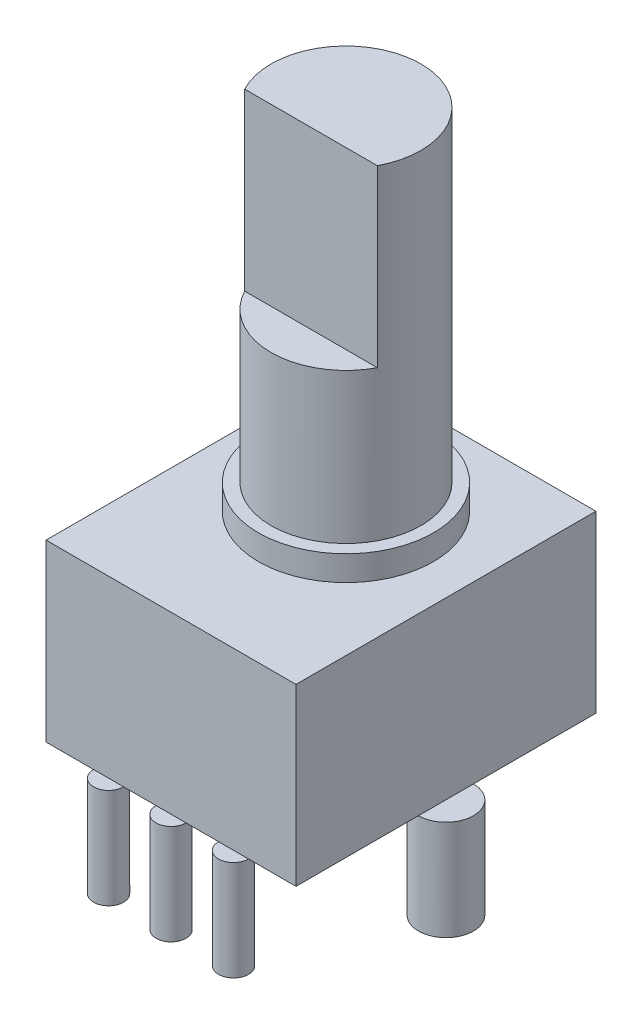
ISO-10303-21;
HEADER;
FILE_DESCRIPTION(('STEP AP214'),'2;1');
FILE_NAME('part.step','',(''),(''),'','','');
FILE_SCHEMA(('AUTOMOTIVE_DESIGN { 1 0 10303 214 1 1 1 1 }'));
ENDSEC;
DATA;
#1=APPLICATION_CONTEXT('core data for automotive mechanical design processes');
#2=APPLICATION_PROTOCOL_DEFINITION('international standard','automotive_design',2000,#1);
#3=PRODUCT_CONTEXT('',#1,'mechanical');
#4=PRODUCT('Part','Part','',(#3));
#5=PRODUCT_RELATED_PRODUCT_CATEGORY('part','',(#4));
#6=PRODUCT_DEFINITION_FORMATION('','',#4);
#7=PRODUCT_DEFINITION_CONTEXT('part definition',#1,'design');
#8=PRODUCT_DEFINITION('design','',#6,#7);
#9=PRODUCT_DEFINITION_SHAPE('','',#8);
#10=(LENGTH_UNIT() NAMED_UNIT(*) SI_UNIT(.MILLI.,.METRE.));
#11=(NAMED_UNIT(*) PLANE_ANGLE_UNIT() SI_UNIT($,.RADIAN.));
#12=(NAMED_UNIT(*) SI_UNIT($,.STERADIAN.) SOLID_ANGLE_UNIT());
#13=UNCERTAINTY_MEASURE_WITH_UNIT(LENGTH_MEASURE(1.E-05),#10,'distance_accuracy_value','');
#14=(GEOMETRIC_REPRESENTATION_CONTEXT(3) GLOBAL_UNCERTAINTY_ASSIGNED_CONTEXT((#13)) GLOBAL_UNIT_ASSIGNED_CONTEXT((#10,
#11,#12)) REPRESENTATION_CONTEXT('',''));
#15=CARTESIAN_POINT('',(0.,0.,0.));
#16=DIRECTION('',(0.,0.,1.));
#17=DIRECTION('',(1.,0.,0.));
#18=AXIS2_PLACEMENT_3D('',#15,#16,#17);
#19=CARTESIAN_POINT('',(0.,6.,-1.));
#20=DIRECTION('',(0.,-1.,0.));
#21=DIRECTION('',(0.,0.,-1.));
#22=AXIS2_PLACEMENT_3D('',#19,#20,#21);
#23=CYLINDRICAL_SURFACE('',#22,3.);
#24=CARTESIAN_POINT('',(0.,6.,-1.));
#25=DIRECTION('',(0.,1.,0.));
#26=DIRECTION('',(0.,0.,1.));
#27=AXIS2_PLACEMENT_3D('',#24,#25,#26);
#28=CIRCLE('',#27,3.);
#29=CARTESIAN_POINT('',(-2.65329983228432,6.,0.399999999999999));
#30=VERTEX_POINT('',#29);
#31=CARTESIAN_POINT('',(2.65329983228432,6.,0.399999999999999));
#32=VERTEX_POINT('',#31);
#33=EDGE_CURVE('E219',#30,#32,#28,.T.);
#34=ORIENTED_EDGE('',*,*,#33,.F.);
#35=DIRECTION('',(0.,-1.,0.));
#36=VECTOR('',#35,1.);
#37=CARTESIAN_POINT('',(-2.65329983228432,13.,0.399999999999999));
#38=LINE('',#37,#36);
#39=CARTESIAN_POINT('',(-2.65329983228432,13.,0.399999999999999));
#40=VERTEX_POINT('',#39);
#41=EDGE_CURVE('E216',#40,#30,#38,.T.);
#42=ORIENTED_EDGE('',*,*,#41,.F.);
#43=CARTESIAN_POINT('',(0.,13.,-1.));
#44=DIRECTION('',(0.,1.,0.));
#45=DIRECTION('',(0.,0.,1.));
#46=AXIS2_PLACEMENT_3D('',#43,#44,#45);
#47=CIRCLE('',#46,3.);
#48=CARTESIAN_POINT('',(2.65329983228432,13.,0.399999999999999));
#49=VERTEX_POINT('',#48);
#50=EDGE_CURVE('E205',#49,#40,#47,.T.);
#51=ORIENTED_EDGE('',*,*,#50,.F.);
#52=DIRECTION('',(0.,-1.,0.));
#53=VECTOR('',#52,1.);
#54=CARTESIAN_POINT('',(2.65329983228432,13.,0.399999999999999));
#55=LINE('',#54,#53);
#56=EDGE_CURVE('E211',#49,#32,#55,.T.);
#57=ORIENTED_EDGE('',*,*,#56,.T.);
#58=EDGE_LOOP('',(#34,#42,#51,#57));
#59=FACE_BOUND('',#58,.T.);
#60=CARTESIAN_POINT('',(0.,0.,-1.));
#61=DIRECTION('',(0.,1.,0.));
#62=DIRECTION('',(0.,0.,1.));
#63=AXIS2_PLACEMENT_3D('',#60,#61,#62);
#64=CIRCLE('',#63,3.);
#65=CARTESIAN_POINT('',(0.,0.,2.));
#66=VERTEX_POINT('',#65);
#67=EDGE_CURVE('E202',#66,#66,#64,.T.);
#68=ORIENTED_EDGE('',*,*,#67,.T.);
#69=EDGE_LOOP('',(#68));
#70=FACE_BOUND('',#69,.T.);
#71=ADVANCED_FACE('F36',(#59,#70),#23,.T.);
#72=CARTESIAN_POINT('',(0.,6.,-1.));
#73=DIRECTION('',(0.,1.,0.));
#74=DIRECTION('',(0.,0.,1.));
#75=AXIS2_PLACEMENT_3D('',#72,#73,#74);
#76=PLANE('',#75);
#77=DIRECTION('',(1.,0.,0.));
#78=VECTOR('',#77,1.);
#79=CARTESIAN_POINT('',(-2.65329983228432,6.,0.399999999999999));
#80=LINE('',#79,#78);
#81=EDGE_CURVE('E209',#30,#32,#80,.T.);
#82=ORIENTED_EDGE('',*,*,#81,.F.);
#83=ORIENTED_EDGE('',*,*,#33,.T.);
#84=EDGE_LOOP('',(#82,#83));
#85=FACE_BOUND('',#84,.T.);
#86=ADVANCED_FACE('F254',(#85),#76,.T.);
#87=CARTESIAN_POINT('',(-2.65329983228432,13.,0.399999999999999));
#88=DIRECTION('',(0.,0.,-1.));
#89=DIRECTION('',(-1.,0.,0.));
#90=AXIS2_PLACEMENT_3D('',#87,#88,#89);
#91=PLANE('',#90);
#92=ORIENTED_EDGE('',*,*,#81,.T.);
#93=ORIENTED_EDGE('',*,*,#56,.F.);
#94=DIRECTION('',(1.,0.,0.));
#95=VECTOR('',#94,1.);
#96=CARTESIAN_POINT('',(-2.65329983228432,13.,0.399999999999999));
#97=LINE('',#96,#95);
#98=EDGE_CURVE('E208',#40,#49,#97,.T.);
#99=ORIENTED_EDGE('',*,*,#98,.F.);
#100=ORIENTED_EDGE('',*,*,#41,.T.);
#101=EDGE_LOOP('',(#92,#93,#99,#100));
#102=FACE_BOUND('',#101,.T.);
#103=ADVANCED_FACE('F259',(#102),#91,.F.);
#104=CARTESIAN_POINT('',(0.,13.,-1.));
#105=DIRECTION('',(0.,1.,0.));
#106=DIRECTION('',(0.,0.,1.));
#107=AXIS2_PLACEMENT_3D('',#104,#105,#106);
#108=PLANE('',#107);
#109=ORIENTED_EDGE('',*,*,#50,.T.);
#110=ORIENTED_EDGE('',*,*,#98,.T.);
#111=EDGE_LOOP('',(#109,#110));
#112=FACE_BOUND('',#111,.T.);
#113=ADVANCED_FACE('F275',(#112),#108,.T.);
#114=CARTESIAN_POINT('',(0.,-1.,-1.));
#115=DIRECTION('',(0.,1.,0.));
#116=DIRECTION('',(0.,0.,1.));
#117=AXIS2_PLACEMENT_3D('',#114,#115,#116);
#118=CYLINDRICAL_SURFACE('',#117,3.5);
#119=CARTESIAN_POINT('',(0.,-1.,-1.));
#120=DIRECTION('',(0.,-1.,0.));
#121=DIRECTION('',(0.,0.,-1.));
#122=AXIS2_PLACEMENT_3D('',#119,#120,#121);
#123=CIRCLE('',#122,3.5);
#124=CARTESIAN_POINT('',(0.,-1.,-4.5));
#125=VERTEX_POINT('',#124);
#126=EDGE_CURVE('E199',#125,#125,#123,.T.);
#127=ORIENTED_EDGE('',*,*,#126,.F.);
#128=EDGE_LOOP('',(#127));
#129=FACE_BOUND('',#128,.T.);
#130=CARTESIAN_POINT('',(0.,0.,-1.));
#131=DIRECTION('',(0.,-1.,0.));
#132=DIRECTION('',(0.,0.,-1.));
#133=AXIS2_PLACEMENT_3D('',#130,#131,#132);
#134=CIRCLE('',#133,3.5);
#135=CARTESIAN_POINT('',(0.,0.,-4.5));
#136=VERTEX_POINT('',#135);
#137=EDGE_CURVE('E198',#136,#136,#134,.T.);
#138=ORIENTED_EDGE('',*,*,#137,.T.);
#139=EDGE_LOOP('',(#138));
#140=FACE_BOUND('',#139,.T.);
#141=ADVANCED_FACE('F270',(#129,#140),#118,.T.);
#142=CARTESIAN_POINT('',(0.,0.,-1.));
#143=DIRECTION('',(0.,-1.,0.));
#144=DIRECTION('',(0.,0.,-1.));
#145=AXIS2_PLACEMENT_3D('',#142,#143,#144);
#146=PLANE('',#145);
#147=ORIENTED_EDGE('',*,*,#67,.F.);
#148=EDGE_LOOP('',(#147));
#149=FACE_BOUND('',#148,.T.);
#150=ORIENTED_EDGE('',*,*,#137,.F.);
#151=EDGE_LOOP('',(#150));
#152=FACE_BOUND('',#151,.T.);
#153=ADVANCED_FACE('F266',(#149,#152),#146,.F.);
#154=CARTESIAN_POINT('',(-5.,-8.,-6.));
#155=DIRECTION('',(1.,0.,0.));
#156=DIRECTION('',(0.,0.,-1.));
#157=AXIS2_PLACEMENT_3D('',#154,#155,#156);
#158=PLANE('',#157);
#159=DIRECTION('',(0.,0.,-1.));
#160=VECTOR('',#159,1.);
#161=CARTESIAN_POINT('',(-5.,-1.,-6.));
#162=LINE('',#161,#160);
#163=CARTESIAN_POINT('',(-5.,-1.,6.));
#164=VERTEX_POINT('',#163);
#165=CARTESIAN_POINT('',(-5.,-1.,-6.));
#166=VERTEX_POINT('',#165);
#167=EDGE_CURVE('E163',#164,#166,#162,.T.);
#168=ORIENTED_EDGE('',*,*,#167,.T.);
#169=DIRECTION('',(0.,1.,0.));
#170=VECTOR('',#169,1.);
#171=CARTESIAN_POINT('',(-5.,-8.,-6.));
#172=LINE('',#171,#170);
#173=CARTESIAN_POINT('',(-5.,-8.,-6.));
#174=VERTEX_POINT('',#173);
#175=EDGE_CURVE('E195',#174,#166,#172,.T.);
#176=ORIENTED_EDGE('',*,*,#175,.F.);
#177=DIRECTION('',(0.,0.,-1.));
#178=VECTOR('',#177,1.);
#179=CARTESIAN_POINT('',(-5.,-8.,-6.));
#180=LINE('',#179,#178);
#181=CARTESIAN_POINT('',(-5.,-8.,-1.09999929514087));
#182=VERTEX_POINT('',#181);
#183=EDGE_CURVE('E171',#182,#174,#180,.T.);
#184=ORIENTED_EDGE('',*,*,#183,.F.);
#185=CARTESIAN_POINT('',(-5.,-8.,1.09999929514087));
#186=VERTEX_POINT('',#185);
#187=EDGE_CURVE('E170',#186,#182,#180,.T.);
#188=ORIENTED_EDGE('',*,*,#187,.F.);
#189=CARTESIAN_POINT('',(-5.,-8.,6.));
#190=VERTEX_POINT('',#189);
#191=EDGE_CURVE('E167',#190,#186,#180,.T.);
#192=ORIENTED_EDGE('',*,*,#191,.F.);
#193=DIRECTION('',(0.,1.,0.));
#194=VECTOR('',#193,1.);
#195=CARTESIAN_POINT('',(-5.,-8.,6.));
#196=LINE('',#195,#194);
#197=EDGE_CURVE('E178',#190,#164,#196,.T.);
#198=ORIENTED_EDGE('',*,*,#197,.T.);
#199=EDGE_LOOP('',(#168,#176,#184,#188,#192,#198));
#200=FACE_BOUND('',#199,.T.);
#201=ADVANCED_FACE('F269',(#200),#158,.F.);
#202=CARTESIAN_POINT('',(-5.,-8.,-6.));
#203=DIRECTION('',(0.,0.,1.));
#204=DIRECTION('',(1.,0.,0.));
#205=AXIS2_PLACEMENT_3D('',#202,#203,#204);
#206=PLANE('',#205);
#207=DIRECTION('',(1.,0.,0.));
#208=VECTOR('',#207,1.);
#209=CARTESIAN_POINT('',(-5.,-1.,-6.));
#210=LINE('',#209,#208);
#211=CARTESIAN_POINT('',(5.,-1.,-6.));
#212=VERTEX_POINT('',#211);
#213=EDGE_CURVE('E181',#166,#212,#210,.T.);
#214=ORIENTED_EDGE('',*,*,#213,.T.);
#215=DIRECTION('',(0.,1.,0.));
#216=VECTOR('',#215,1.);
#217=CARTESIAN_POINT('',(5.,-8.,-6.));
#218=LINE('',#217,#216);
#219=CARTESIAN_POINT('',(5.,-8.,-6.));
#220=VERTEX_POINT('',#219);
#221=EDGE_CURVE('E192',#220,#212,#218,.T.);
#222=ORIENTED_EDGE('',*,*,#221,.F.);
#223=DIRECTION('',(1.,0.,0.));
#224=VECTOR('',#223,1.);
#225=CARTESIAN_POINT('',(-5.,-8.,-6.));
#226=LINE('',#225,#224);
#227=EDGE_CURVE('E169',#174,#220,#226,.T.);
#228=ORIENTED_EDGE('',*,*,#227,.F.);
#229=ORIENTED_EDGE('',*,*,#175,.T.);
#230=EDGE_LOOP('',(#214,#222,#228,#229));
#231=FACE_BOUND('',#230,.T.);
#232=ADVANCED_FACE('F315',(#231),#206,.F.);
#233=CARTESIAN_POINT('',(5.,-8.,-6.));
#234=DIRECTION('',(-1.,0.,0.));
#235=DIRECTION('',(0.,0.,1.));
#236=AXIS2_PLACEMENT_3D('',#233,#234,#235);
#237=PLANE('',#236);
#238=DIRECTION('',(0.,0.,1.));
#239=VECTOR('',#238,1.);
#240=CARTESIAN_POINT('',(5.,-1.,-6.));
#241=LINE('',#240,#239);
#242=CARTESIAN_POINT('',(5.,-1.,6.));
#243=VERTEX_POINT('',#242);
#244=EDGE_CURVE('E183',#212,#243,#241,.T.);
#245=ORIENTED_EDGE('',*,*,#244,.T.);
#246=DIRECTION('',(0.,1.,0.));
#247=VECTOR('',#246,1.);
#248=CARTESIAN_POINT('',(5.,-8.,6.));
#249=LINE('',#248,#247);
#250=CARTESIAN_POINT('',(5.,-8.,6.));
#251=VERTEX_POINT('',#250);
#252=EDGE_CURVE('E189',#251,#243,#249,.T.);
#253=ORIENTED_EDGE('',*,*,#252,.F.);
#254=DIRECTION('',(0.,0.,1.));
#255=VECTOR('',#254,1.);
#256=CARTESIAN_POINT('',(5.,-8.,-6.));
#257=LINE('',#256,#255);
#258=CARTESIAN_POINT('',(5.,-8.,1.1));
#259=VERTEX_POINT('',#258);
#260=EDGE_CURVE('E173',#259,#251,#257,.T.);
#261=ORIENTED_EDGE('',*,*,#260,.F.);
#262=CARTESIAN_POINT('',(5.,-8.,-1.1));
#263=VERTEX_POINT('',#262);
#264=EDGE_CURVE('E175',#263,#259,#257,.T.);
#265=ORIENTED_EDGE('',*,*,#264,.F.);
#266=EDGE_CURVE('E174',#220,#263,#257,.T.);
#267=ORIENTED_EDGE('',*,*,#266,.F.);
#268=ORIENTED_EDGE('',*,*,#221,.T.);
#269=EDGE_LOOP('',(#245,#253,#261,#265,#267,#268));
#270=FACE_BOUND('',#269,.T.);
#271=ADVANCED_FACE('F321',(#270),#237,.F.);
#272=CARTESIAN_POINT('',(-5.,-8.,6.));
#273=DIRECTION('',(0.,0.,-1.));
#274=DIRECTION('',(-1.,0.,0.));
#275=AXIS2_PLACEMENT_3D('',#272,#273,#274);
#276=PLANE('',#275);
#277=DIRECTION('',(-1.,0.,0.));
#278=VECTOR('',#277,1.);
#279=CARTESIAN_POINT('',(-5.,-1.,6.));
#280=LINE('',#279,#278);
#281=EDGE_CURVE('E185',#243,#164,#280,.T.);
#282=ORIENTED_EDGE('',*,*,#281,.T.);
#283=ORIENTED_EDGE('',*,*,#197,.F.);
#284=DIRECTION('',(-1.,0.,0.));
#285=VECTOR('',#284,1.);
#286=CARTESIAN_POINT('',(-5.,-8.,6.));
#287=LINE('',#286,#285);
#288=CARTESIAN_POINT('',(-3.1,-8.,6.));
#289=VERTEX_POINT('',#288);
#290=EDGE_CURVE('E127',#289,#190,#287,.T.);
#291=ORIENTED_EDGE('',*,*,#290,.F.);
#292=CARTESIAN_POINT('',(-1.9,-8.,6.));
#293=VERTEX_POINT('',#292);
#294=EDGE_CURVE('E121',#293,#289,#287,.T.);
#295=ORIENTED_EDGE('',*,*,#294,.F.);
#296=CARTESIAN_POINT('',(-0.599999999999999,-8.,6.));
#297=VERTEX_POINT('',#296);
#298=EDGE_CURVE('E112',#297,#293,#287,.T.);
#299=ORIENTED_EDGE('',*,*,#298,.F.);
#300=CARTESIAN_POINT('',(0.600000000000001,-8.,6.));
#301=VERTEX_POINT('',#300);
#302=EDGE_CURVE('E120',#301,#297,#287,.T.);
#303=ORIENTED_EDGE('',*,*,#302,.F.);
#304=CARTESIAN_POINT('',(1.9,-8.,6.));
#305=VERTEX_POINT('',#304);
#306=EDGE_CURVE('E131',#305,#301,#287,.T.);
#307=ORIENTED_EDGE('',*,*,#306,.F.);
#308=CARTESIAN_POINT('',(3.1,-8.,6.));
#309=VERTEX_POINT('',#308);
#310=EDGE_CURVE('E123',#309,#305,#287,.T.);
#311=ORIENTED_EDGE('',*,*,#310,.F.);
#312=EDGE_CURVE('E176',#251,#309,#287,.T.);
#313=ORIENTED_EDGE('',*,*,#312,.F.);
#314=ORIENTED_EDGE('',*,*,#252,.T.);
#315=EDGE_LOOP('',(#282,#283,#291,#295,#299,#303,#307,#311,#313,#314));
#316=FACE_BOUND('',#315,.T.);
#317=ADVANCED_FACE('F125',(#316),#276,.F.);
#318=CARTESIAN_POINT('',(0.,-8.,0.));
#319=DIRECTION('',(0.,1.,0.));
#320=DIRECTION('',(0.,0.,1.));
#321=AXIS2_PLACEMENT_3D('',#318,#319,#320);
#322=PLANE('',#321);
#323=CARTESIAN_POINT('',(-2.5,-8.,6.));
#324=DIRECTION('',(0.,1.,0.));
#325=DIRECTION('',(0.,0.,1.));
#326=AXIS2_PLACEMENT_3D('',#323,#324,#325);
#327=CIRCLE('',#326,0.6);
#328=EDGE_CURVE('E11',#289,#293,#327,.F.);
#329=ORIENTED_EDGE('',*,*,#328,.F.);
#330=ORIENTED_EDGE('',*,*,#290,.T.);
#331=ORIENTED_EDGE('',*,*,#191,.T.);
#332=CARTESIAN_POINT('',(-5.00124526687685,-8.,0.));
#333=DIRECTION('',(0.,-1.,0.));
#334=DIRECTION('',(0.,0.,-1.));
#335=AXIS2_PLACEMENT_3D('',#332,#333,#334);
#336=CIRCLE('',#335,1.1);
#337=EDGE_CURVE('E164',#182,#186,#336,.T.);
#338=ORIENTED_EDGE('',*,*,#337,.F.);
#339=ORIENTED_EDGE('',*,*,#183,.T.);
#340=ORIENTED_EDGE('',*,*,#227,.T.);
#341=ORIENTED_EDGE('',*,*,#266,.T.);
#342=CARTESIAN_POINT('',(5.,-8.,0.));
#343=DIRECTION('',(0.,1.,0.));
#344=DIRECTION('',(0.,0.,1.));
#345=AXIS2_PLACEMENT_3D('',#342,#343,#344);
#346=CIRCLE('',#345,1.1);
#347=EDGE_CURVE('E221',#259,#263,#346,.F.);
#348=ORIENTED_EDGE('',*,*,#347,.F.);
#349=ORIENTED_EDGE('',*,*,#260,.T.);
#350=ORIENTED_EDGE('',*,*,#312,.T.);
#351=CARTESIAN_POINT('',(2.5,-8.,6.));
#352=DIRECTION('',(0.,1.,0.));
#353=DIRECTION('',(0.,0.,1.));
#354=AXIS2_PLACEMENT_3D('',#351,#352,#353);
#355=CIRCLE('',#354,0.6);
#356=EDGE_CURVE('E43',#305,#309,#355,.F.);
#357=ORIENTED_EDGE('',*,*,#356,.F.);
#358=ORIENTED_EDGE('',*,*,#306,.T.);
#359=CARTESIAN_POINT('',(0.,-8.,6.));
#360=DIRECTION('',(0.,1.,0.));
#361=DIRECTION('',(0.,0.,1.));
#362=AXIS2_PLACEMENT_3D('',#359,#360,#361);
#363=CIRCLE('',#362,0.6);
#364=EDGE_CURVE('E116',#297,#301,#363,.F.);
#365=ORIENTED_EDGE('',*,*,#364,.F.);
#366=ORIENTED_EDGE('',*,*,#298,.T.);
#367=EDGE_LOOP('',(#329,#330,#331,#338,#339,#340,#341,#348,#349,#350,#357,#358,#365,#366));
#368=FACE_BOUND('',#367,.T.);
#369=ADVANCED_FACE('F114',(#368),#322,.F.);
#370=CARTESIAN_POINT('',(0.,-1.,0.));
#371=DIRECTION('',(0.,1.,0.));
#372=DIRECTION('',(0.,0.,1.));
#373=AXIS2_PLACEMENT_3D('',#370,#371,#372);
#374=PLANE('',#373);
#375=ORIENTED_EDGE('',*,*,#126,.T.);
#376=EDGE_LOOP('',(#375));
#377=FACE_BOUND('',#376,.T.);
#378=ORIENTED_EDGE('',*,*,#167,.F.);
#379=ORIENTED_EDGE('',*,*,#281,.F.);
#380=ORIENTED_EDGE('',*,*,#244,.F.);
#381=ORIENTED_EDGE('',*,*,#213,.F.);
#382=EDGE_LOOP('',(#378,#379,#380,#381));
#383=FACE_BOUND('',#382,.T.);
#384=ADVANCED_FACE('F330',(#377,#383),#374,.T.);
#385=CARTESIAN_POINT('',(-5.00124526687685,-8.,0.));
#386=DIRECTION('',(0.,-1.,0.));
#387=DIRECTION('',(0.,0.,-1.));
#388=AXIS2_PLACEMENT_3D('',#385,#386,#387);
#389=PLANE('',#388);
#390=EDGE_CURVE('E157',#186,#182,#336,.T.);
#391=ORIENTED_EDGE('',*,*,#390,.F.);
#392=ORIENTED_EDGE('',*,*,#187,.T.);
#393=EDGE_LOOP('',(#391,#392));
#394=FACE_BOUND('',#393,.T.);
#395=ADVANCED_FACE('F335',(#394),#389,.F.);
#396=CARTESIAN_POINT('',(-5.00124526687685,-12.,0.));
#397=DIRECTION('',(0.,1.,0.));
#398=DIRECTION('',(0.,0.,1.));
#399=AXIS2_PLACEMENT_3D('',#396,#397,#398);
#400=CYLINDRICAL_SURFACE('',#399,1.1);
#401=CARTESIAN_POINT('',(-5.00124526687685,-12.,0.));
#402=DIRECTION('',(0.,-1.,0.));
#403=DIRECTION('',(0.,0.,-1.));
#404=AXIS2_PLACEMENT_3D('',#401,#402,#403);
#405=CIRCLE('',#404,1.1);
#406=CARTESIAN_POINT('',(-5.00124526687685,-12.,-1.1));
#407=VERTEX_POINT('',#406);
#408=EDGE_CURVE('E160',#407,#407,#405,.T.);
#409=ORIENTED_EDGE('',*,*,#408,.F.);
#410=EDGE_LOOP('',(#409));
#411=FACE_BOUND('',#410,.T.);
#412=ORIENTED_EDGE('',*,*,#337,.T.);
#413=ORIENTED_EDGE('',*,*,#390,.T.);
#414=EDGE_LOOP('',(#412,#413));
#415=FACE_BOUND('',#414,.T.);
#416=ADVANCED_FACE('F363',(#411,#415),#400,.T.);
#417=CARTESIAN_POINT('',(-5.00124526687685,-12.,0.));
#418=DIRECTION('',(0.,-1.,0.));
#419=DIRECTION('',(0.,0.,-1.));
#420=AXIS2_PLACEMENT_3D('',#417,#418,#419);
#421=PLANE('',#420);
#422=ORIENTED_EDGE('',*,*,#408,.T.);
#423=EDGE_LOOP('',(#422));
#424=FACE_BOUND('',#423,.T.);
#425=ADVANCED_FACE('F373',(#424),#421,.T.);
#426=CARTESIAN_POINT('',(5.,-8.,0.));
#427=DIRECTION('',(0.,-1.,0.));
#428=DIRECTION('',(0.,0.,-1.));
#429=AXIS2_PLACEMENT_3D('',#426,#427,#428);
#430=PLANE('',#429);
#431=CARTESIAN_POINT('',(5.,-8.,0.));
#432=DIRECTION('',(0.,-1.,0.));
#433=DIRECTION('',(0.,0.,-1.));
#434=AXIS2_PLACEMENT_3D('',#431,#432,#433);
#435=CIRCLE('',#434,1.1);
#436=EDGE_CURVE('E151',#263,#259,#435,.T.);
#437=ORIENTED_EDGE('',*,*,#436,.F.);
#438=ORIENTED_EDGE('',*,*,#264,.T.);
#439=EDGE_LOOP('',(#437,#438));
#440=FACE_BOUND('',#439,.T.);
#441=ADVANCED_FACE('F383',(#440),#430,.F.);
#442=CARTESIAN_POINT('',(5.,-12.,0.));
#443=DIRECTION('',(0.,1.,0.));
#444=DIRECTION('',(0.,0.,1.));
#445=AXIS2_PLACEMENT_3D('',#442,#443,#444);
#446=CYLINDRICAL_SURFACE('',#445,1.1);
#447=CARTESIAN_POINT('',(5.,-12.,0.));
#448=DIRECTION('',(0.,-1.,0.));
#449=DIRECTION('',(0.,0.,-1.));
#450=AXIS2_PLACEMENT_3D('',#447,#448,#449);
#451=CIRCLE('',#450,1.1);
#452=CARTESIAN_POINT('',(5.,-12.,-1.1));
#453=VERTEX_POINT('',#452);
#454=EDGE_CURVE('E154',#453,#453,#451,.T.);
#455=ORIENTED_EDGE('',*,*,#454,.F.);
#456=EDGE_LOOP('',(#455));
#457=FACE_BOUND('',#456,.T.);
#458=ORIENTED_EDGE('',*,*,#436,.T.);
#459=ORIENTED_EDGE('',*,*,#347,.T.);
#460=EDGE_LOOP('',(#458,#459));
#461=FACE_BOUND('',#460,.T.);
#462=ADVANCED_FACE('F393',(#457,#461),#446,.T.);
#463=CARTESIAN_POINT('',(5.,-12.,0.));
#464=DIRECTION('',(0.,-1.,0.));
#465=DIRECTION('',(0.,0.,-1.));
#466=AXIS2_PLACEMENT_3D('',#463,#464,#465);
#467=PLANE('',#466);
#468=ORIENTED_EDGE('',*,*,#454,.T.);
#469=EDGE_LOOP('',(#468));
#470=FACE_BOUND('',#469,.T.);
#471=ADVANCED_FACE('F249',(#470),#467,.T.);
#472=CARTESIAN_POINT('',(0.,-8.,6.));
#473=DIRECTION('',(0.,-1.,0.));
#474=DIRECTION('',(0.,0.,-1.));
#475=AXIS2_PLACEMENT_3D('',#472,#473,#474);
#476=PLANE('',#475);
#477=CARTESIAN_POINT('',(0.,-8.,6.));
#478=DIRECTION('',(0.,-1.,0.));
#479=DIRECTION('',(0.,0.,-1.));
#480=AXIS2_PLACEMENT_3D('',#477,#478,#479);
#481=CIRCLE('',#480,0.6);
#482=EDGE_CURVE('E145',#301,#297,#481,.T.);
#483=ORIENTED_EDGE('',*,*,#482,.F.);
#484=ORIENTED_EDGE('',*,*,#302,.T.);
#485=EDGE_LOOP('',(#483,#484));
#486=FACE_BOUND('',#485,.T.);
#487=ADVANCED_FACE('F236',(#486),#476,.F.);
#488=CARTESIAN_POINT('',(0.,-12.,6.));
#489=DIRECTION('',(0.,1.,0.));
#490=DIRECTION('',(0.,0.,1.));
#491=AXIS2_PLACEMENT_3D('',#488,#489,#490);
#492=CYLINDRICAL_SURFACE('',#491,0.6);
#493=CARTESIAN_POINT('',(0.,-12.,6.));
#494=DIRECTION('',(0.,-1.,0.));
#495=DIRECTION('',(0.,0.,-1.));
#496=AXIS2_PLACEMENT_3D('',#493,#494,#495);
#497=CIRCLE('',#496,0.6);
#498=CARTESIAN_POINT('',(0.,-12.,5.4));
#499=VERTEX_POINT('',#498);
#500=EDGE_CURVE('E148',#499,#499,#497,.T.);
#501=ORIENTED_EDGE('',*,*,#500,.F.);
#502=EDGE_LOOP('',(#501));
#503=FACE_BOUND('',#502,.T.);
#504=ORIENTED_EDGE('',*,*,#482,.T.);
#505=ORIENTED_EDGE('',*,*,#364,.T.);
#506=EDGE_LOOP('',(#504,#505));
#507=FACE_BOUND('',#506,.T.);
#508=ADVANCED_FACE('F238',(#503,#507),#492,.T.);
#509=CARTESIAN_POINT('',(0.,-12.,6.));
#510=DIRECTION('',(0.,-1.,0.));
#511=DIRECTION('',(0.,0.,-1.));
#512=AXIS2_PLACEMENT_3D('',#509,#510,#511);
#513=PLANE('',#512);
#514=ORIENTED_EDGE('',*,*,#500,.T.);
#515=EDGE_LOOP('',(#514));
#516=FACE_BOUND('',#515,.T.);
#517=ADVANCED_FACE('F240',(#516),#513,.T.);
#518=CARTESIAN_POINT('',(2.5,-8.,6.));
#519=DIRECTION('',(0.,-1.,0.));
#520=DIRECTION('',(0.,0.,-1.));
#521=AXIS2_PLACEMENT_3D('',#518,#519,#520);
#522=PLANE('',#521);
#523=CARTESIAN_POINT('',(2.5,-8.,6.));
#524=DIRECTION('',(0.,-1.,0.));
#525=DIRECTION('',(0.,0.,-1.));
#526=AXIS2_PLACEMENT_3D('',#523,#524,#525);
#527=CIRCLE('',#526,0.6);
#528=EDGE_CURVE('E139',#309,#305,#527,.T.);
#529=ORIENTED_EDGE('',*,*,#528,.F.);
#530=ORIENTED_EDGE('',*,*,#310,.T.);
#531=EDGE_LOOP('',(#529,#530));
#532=FACE_BOUND('',#531,.T.);
#533=ADVANCED_FACE('F231',(#532),#522,.F.);
#534=CARTESIAN_POINT('',(2.5,-12.,6.));
#535=DIRECTION('',(0.,1.,0.));
#536=DIRECTION('',(0.,0.,1.));
#537=AXIS2_PLACEMENT_3D('',#534,#535,#536);
#538=CYLINDRICAL_SURFACE('',#537,0.6);
#539=CARTESIAN_POINT('',(2.5,-12.,6.));
#540=DIRECTION('',(0.,-1.,0.));
#541=DIRECTION('',(0.,0.,-1.));
#542=AXIS2_PLACEMENT_3D('',#539,#540,#541);
#543=CIRCLE('',#542,0.6);
#544=CARTESIAN_POINT('',(2.5,-12.,5.4));
#545=VERTEX_POINT('',#544);
#546=EDGE_CURVE('E142',#545,#545,#543,.T.);
#547=ORIENTED_EDGE('',*,*,#546,.F.);
#548=EDGE_LOOP('',(#547));
#549=FACE_BOUND('',#548,.T.);
#550=ORIENTED_EDGE('',*,*,#528,.T.);
#551=ORIENTED_EDGE('',*,*,#356,.T.);
#552=EDGE_LOOP('',(#550,#551));
#553=FACE_BOUND('',#552,.T.);
#554=ADVANCED_FACE('F228',(#549,#553),#538,.T.);
#555=CARTESIAN_POINT('',(2.5,-12.,6.));
#556=DIRECTION('',(0.,-1.,0.));
#557=DIRECTION('',(0.,0.,-1.));
#558=AXIS2_PLACEMENT_3D('',#555,#556,#557);
#559=PLANE('',#558);
#560=ORIENTED_EDGE('',*,*,#546,.T.);
#561=EDGE_LOOP('',(#560));
#562=FACE_BOUND('',#561,.T.);
#563=ADVANCED_FACE('F455',(#562),#559,.T.);
#564=CARTESIAN_POINT('',(-2.5,-8.,6.));
#565=DIRECTION('',(0.,-1.,0.));
#566=DIRECTION('',(0.,0.,-1.));
#567=AXIS2_PLACEMENT_3D('',#564,#565,#566);
#568=PLANE('',#567);
#569=CARTESIAN_POINT('',(-2.5,-8.,6.));
#570=DIRECTION('',(0.,-1.,0.));
#571=DIRECTION('',(0.,0.,-1.));
#572=AXIS2_PLACEMENT_3D('',#569,#570,#571);
#573=CIRCLE('',#572,0.6);
#574=EDGE_CURVE('E134',#293,#289,#573,.T.);
#575=ORIENTED_EDGE('',*,*,#574,.F.);
#576=ORIENTED_EDGE('',*,*,#294,.T.);
#577=EDGE_LOOP('',(#575,#576));
#578=FACE_BOUND('',#577,.T.);
#579=ADVANCED_FACE('F135',(#578),#568,.F.);
#580=CARTESIAN_POINT('',(-2.5,-12.,6.));
#581=DIRECTION('',(0.,1.,0.));
#582=DIRECTION('',(0.,0.,1.));
#583=AXIS2_PLACEMENT_3D('',#580,#581,#582);
#584=CYLINDRICAL_SURFACE('',#583,0.6);
#585=CARTESIAN_POINT('',(-2.5,-12.,6.));
#586=DIRECTION('',(0.,-1.,0.));
#587=DIRECTION('',(0.,0.,-1.));
#588=AXIS2_PLACEMENT_3D('',#585,#586,#587);
#589=CIRCLE('',#588,0.6);
#590=CARTESIAN_POINT('',(-2.5,-12.,5.4));
#591=VERTEX_POINT('',#590);
#592=EDGE_CURVE('E136',#591,#591,#589,.T.);
#593=ORIENTED_EDGE('',*,*,#592,.F.);
#594=EDGE_LOOP('',(#593));
#595=FACE_BOUND('',#594,.T.);
#596=ORIENTED_EDGE('',*,*,#574,.T.);
#597=ORIENTED_EDGE('',*,*,#328,.T.);
#598=EDGE_LOOP('',(#596,#597));
#599=FACE_BOUND('',#598,.T.);
#600=ADVANCED_FACE('F133',(#595,#599),#584,.T.);
#601=CARTESIAN_POINT('',(-2.5,-12.,6.));
#602=DIRECTION('',(0.,-1.,0.));
#603=DIRECTION('',(0.,0.,-1.));
#604=AXIS2_PLACEMENT_3D('',#601,#602,#603);
#605=PLANE('',#604);
#606=ORIENTED_EDGE('',*,*,#592,.T.);
#607=EDGE_LOOP('',(#606));
#608=FACE_BOUND('',#607,.T.);
#609=ADVANCED_FACE('F482',(#608),#605,.T.);
#610=CLOSED_SHELL('',(#71,#86,#103,#113,#141,#153,#201,#232,#271,#317,#369,#384,#395,#416,#425,
#441,#462,#471,#487,#508,#517,#533,#554,#563,#579,#600,#609));
#611=MANIFOLD_SOLID_BREP('B2',#610);
#612=ADVANCED_BREP_SHAPE_REPRESENTATION('',(#18,#611),#14);
#613=SHAPE_DEFINITION_REPRESENTATION(#9,#612);
ENDSEC;
END-ISO-10303-21;
